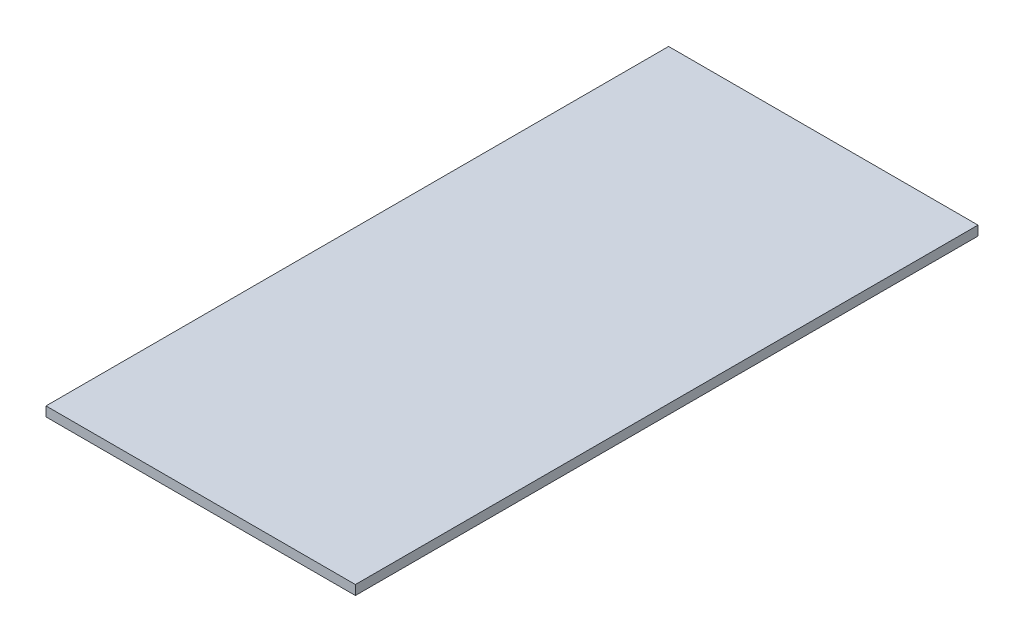
ISO-10303-21;
HEADER;
FILE_DESCRIPTION(('STEP AP214'),'2;1');
FILE_NAME('part.step','',(''),(''),'','','');
FILE_SCHEMA(('AUTOMOTIVE_DESIGN { 1 0 10303 214 1 1 1 1 }'));
ENDSEC;
DATA;
#1=APPLICATION_CONTEXT('core data for automotive mechanical design processes');
#2=APPLICATION_PROTOCOL_DEFINITION('international standard','automotive_design',2000,#1);
#3=PRODUCT_CONTEXT('',#1,'mechanical');
#4=PRODUCT('Part','Part','',(#3));
#5=PRODUCT_RELATED_PRODUCT_CATEGORY('part','',(#4));
#6=PRODUCT_DEFINITION_FORMATION('','',#4);
#7=PRODUCT_DEFINITION_CONTEXT('part definition',#1,'design');
#8=PRODUCT_DEFINITION('design','',#6,#7);
#9=PRODUCT_DEFINITION_SHAPE('','',#8);
#10=(LENGTH_UNIT() NAMED_UNIT(*) SI_UNIT(.MILLI.,.METRE.));
#11=(NAMED_UNIT(*) PLANE_ANGLE_UNIT() SI_UNIT($,.RADIAN.));
#12=(NAMED_UNIT(*) SI_UNIT($,.STERADIAN.) SOLID_ANGLE_UNIT());
#13=UNCERTAINTY_MEASURE_WITH_UNIT(LENGTH_MEASURE(1.E-05),#10,'distance_accuracy_value','');
#14=(GEOMETRIC_REPRESENTATION_CONTEXT(3) GLOBAL_UNCERTAINTY_ASSIGNED_CONTEXT((#13)) GLOBAL_UNIT_ASSIGNED_CONTEXT((#10,
#11,#12)) REPRESENTATION_CONTEXT('',''));
#15=CARTESIAN_POINT('',(0.,0.,0.));
#16=DIRECTION('',(0.,0.,1.));
#17=DIRECTION('',(1.,0.,0.));
#18=AXIS2_PLACEMENT_3D('',#15,#16,#17);
#19=CARTESIAN_POINT('',(0.,3.175,0.));
#20=DIRECTION('',(1.,0.,0.));
#21=DIRECTION('',(0.,0.,-1.));
#22=AXIS2_PLACEMENT_3D('',#19,#20,#21);
#23=PLANE('',#22);
#24=DIRECTION('',(0.,0.,1.));
#25=VECTOR('',#24,1.);
#26=CARTESIAN_POINT('',(0.,0.,0.));
#27=LINE('',#26,#25);
#28=CARTESIAN_POINT('',(0.,0.,-207.01));
#29=VERTEX_POINT('',#28);
#30=CARTESIAN_POINT('',(0.,0.,0.));
#31=VERTEX_POINT('',#30);
#32=EDGE_CURVE('E96',#29,#31,#27,.T.);
#33=ORIENTED_EDGE('',*,*,#32,.T.);
#34=DIRECTION('',(0.,-1.,0.));
#35=VECTOR('',#34,1.);
#36=CARTESIAN_POINT('',(0.,3.175,0.));
#37=LINE('',#36,#35);
#38=CARTESIAN_POINT('',(0.,3.175,0.));
#39=VERTEX_POINT('',#38);
#40=EDGE_CURVE('E11',#39,#31,#37,.T.);
#41=ORIENTED_EDGE('',*,*,#40,.F.);
#42=DIRECTION('',(0.,0.,1.));
#43=VECTOR('',#42,1.);
#44=CARTESIAN_POINT('',(0.,3.175,0.));
#45=LINE('',#44,#43);
#46=CARTESIAN_POINT('',(0.,3.175,-207.01));
#47=VERTEX_POINT('',#46);
#48=EDGE_CURVE('E84',#47,#39,#45,.T.);
#49=ORIENTED_EDGE('',*,*,#48,.F.);
#50=DIRECTION('',(0.,-1.,0.));
#51=VECTOR('',#50,1.);
#52=CARTESIAN_POINT('',(0.,3.175,-207.01));
#53=LINE('',#52,#51);
#54=EDGE_CURVE('E92',#47,#29,#53,.T.);
#55=ORIENTED_EDGE('',*,*,#54,.T.);
#56=EDGE_LOOP('',(#33,#41,#49,#55));
#57=FACE_BOUND('',#56,.T.);
#58=ADVANCED_FACE('F33',(#57),#23,.F.);
#59=CARTESIAN_POINT('',(0.,3.175,0.));
#60=DIRECTION('',(0.,0.,-1.));
#61=DIRECTION('',(-1.,0.,0.));
#62=AXIS2_PLACEMENT_3D('',#59,#60,#61);
#63=PLANE('',#62);
#64=DIRECTION('',(1.,0.,0.));
#65=VECTOR('',#64,1.);
#66=CARTESIAN_POINT('',(0.,0.,0.));
#67=LINE('',#66,#65);
#68=CARTESIAN_POINT('',(102.87,0.,0.));
#69=VERTEX_POINT('',#68);
#70=EDGE_CURVE('E88',#31,#69,#67,.T.);
#71=ORIENTED_EDGE('',*,*,#70,.T.);
#72=DIRECTION('',(0.,-1.,0.));
#73=VECTOR('',#72,1.);
#74=CARTESIAN_POINT('',(102.87,3.175,0.));
#75=LINE('',#74,#73);
#76=CARTESIAN_POINT('',(102.87,3.175,0.));
#77=VERTEX_POINT('',#76);
#78=EDGE_CURVE('E41',#77,#69,#75,.T.);
#79=ORIENTED_EDGE('',*,*,#78,.F.);
#80=DIRECTION('',(1.,0.,0.));
#81=VECTOR('',#80,1.);
#82=CARTESIAN_POINT('',(0.,3.175,0.));
#83=LINE('',#82,#81);
#84=EDGE_CURVE('E79',#39,#77,#83,.T.);
#85=ORIENTED_EDGE('',*,*,#84,.F.);
#86=ORIENTED_EDGE('',*,*,#40,.T.);
#87=EDGE_LOOP('',(#71,#79,#85,#86));
#88=FACE_BOUND('',#87,.T.);
#89=ADVANCED_FACE('F87',(#88),#63,.F.);
#90=CARTESIAN_POINT('',(102.87,3.175,0.));
#91=DIRECTION('',(-1.,0.,0.));
#92=DIRECTION('',(0.,0.,1.));
#93=AXIS2_PLACEMENT_3D('',#90,#91,#92);
#94=PLANE('',#93);
#95=DIRECTION('',(0.,0.,-1.));
#96=VECTOR('',#95,1.);
#97=CARTESIAN_POINT('',(102.87,0.,0.));
#98=LINE('',#97,#96);
#99=CARTESIAN_POINT('',(102.87,0.,-207.01));
#100=VERTEX_POINT('',#99);
#101=EDGE_CURVE('E66',#69,#100,#98,.T.);
#102=ORIENTED_EDGE('',*,*,#101,.T.);
#103=DIRECTION('',(0.,-1.,0.));
#104=VECTOR('',#103,1.);
#105=CARTESIAN_POINT('',(102.87,3.175,-207.01));
#106=LINE('',#105,#104);
#107=CARTESIAN_POINT('',(102.87,3.175,-207.01));
#108=VERTEX_POINT('',#107);
#109=EDGE_CURVE('E89',#108,#100,#106,.T.);
#110=ORIENTED_EDGE('',*,*,#109,.F.);
#111=DIRECTION('',(0.,0.,-1.));
#112=VECTOR('',#111,1.);
#113=CARTESIAN_POINT('',(102.87,3.175,0.));
#114=LINE('',#113,#112);
#115=EDGE_CURVE('E82',#77,#108,#114,.T.);
#116=ORIENTED_EDGE('',*,*,#115,.F.);
#117=ORIENTED_EDGE('',*,*,#78,.T.);
#118=EDGE_LOOP('',(#102,#110,#116,#117));
#119=FACE_BOUND('',#118,.T.);
#120=ADVANCED_FACE('F90',(#119),#94,.F.);
#121=CARTESIAN_POINT('',(0.,3.175,-207.01));
#122=DIRECTION('',(0.,0.,1.));
#123=DIRECTION('',(1.,0.,0.));
#124=AXIS2_PLACEMENT_3D('',#121,#122,#123);
#125=PLANE('',#124);
#126=DIRECTION('',(-1.,0.,0.));
#127=VECTOR('',#126,1.);
#128=CARTESIAN_POINT('',(0.,0.,-207.01));
#129=LINE('',#128,#127);
#130=EDGE_CURVE('E72',#100,#29,#129,.T.);
#131=ORIENTED_EDGE('',*,*,#130,.T.);
#132=ORIENTED_EDGE('',*,*,#54,.F.);
#133=DIRECTION('',(-1.,0.,0.));
#134=VECTOR('',#133,1.);
#135=CARTESIAN_POINT('',(0.,3.175,-207.01));
#136=LINE('',#135,#134);
#137=EDGE_CURVE('E49',#108,#47,#136,.T.);
#138=ORIENTED_EDGE('',*,*,#137,.F.);
#139=ORIENTED_EDGE('',*,*,#109,.T.);
#140=EDGE_LOOP('',(#131,#132,#138,#139));
#141=FACE_BOUND('',#140,.T.);
#142=ADVANCED_FACE('F103',(#141),#125,.F.);
#143=CARTESIAN_POINT('',(0.,3.175,0.));
#144=DIRECTION('',(0.,-1.,0.));
#145=DIRECTION('',(0.,0.,-1.));
#146=AXIS2_PLACEMENT_3D('',#143,#144,#145);
#147=PLANE('',#146);
#148=ORIENTED_EDGE('',*,*,#48,.T.);
#149=ORIENTED_EDGE('',*,*,#84,.T.);
#150=ORIENTED_EDGE('',*,*,#115,.T.);
#151=ORIENTED_EDGE('',*,*,#137,.T.);
#152=EDGE_LOOP('',(#148,#149,#150,#151));
#153=FACE_BOUND('',#152,.T.);
#154=ADVANCED_FACE('F80',(#153),#147,.F.);
#155=CARTESIAN_POINT('',(0.,0.,0.));
#156=DIRECTION('',(0.,-1.,0.));
#157=DIRECTION('',(0.,0.,-1.));
#158=AXIS2_PLACEMENT_3D('',#155,#156,#157);
#159=PLANE('',#158);
#160=ORIENTED_EDGE('',*,*,#32,.F.);
#161=ORIENTED_EDGE('',*,*,#130,.F.);
#162=ORIENTED_EDGE('',*,*,#101,.F.);
#163=ORIENTED_EDGE('',*,*,#70,.F.);
#164=EDGE_LOOP('',(#160,#161,#162,#163));
#165=FACE_BOUND('',#164,.T.);
#166=ADVANCED_FACE('F106',(#165),#159,.T.);
#167=CLOSED_SHELL('',(#58,#89,#120,#142,#154,#166));
#168=MANIFOLD_SOLID_BREP('B2',#167);
#169=ADVANCED_BREP_SHAPE_REPRESENTATION('',(#18,#168),#14);
#170=SHAPE_DEFINITION_REPRESENTATION(#9,#169);
ENDSEC;
END-ISO-10303-21;
